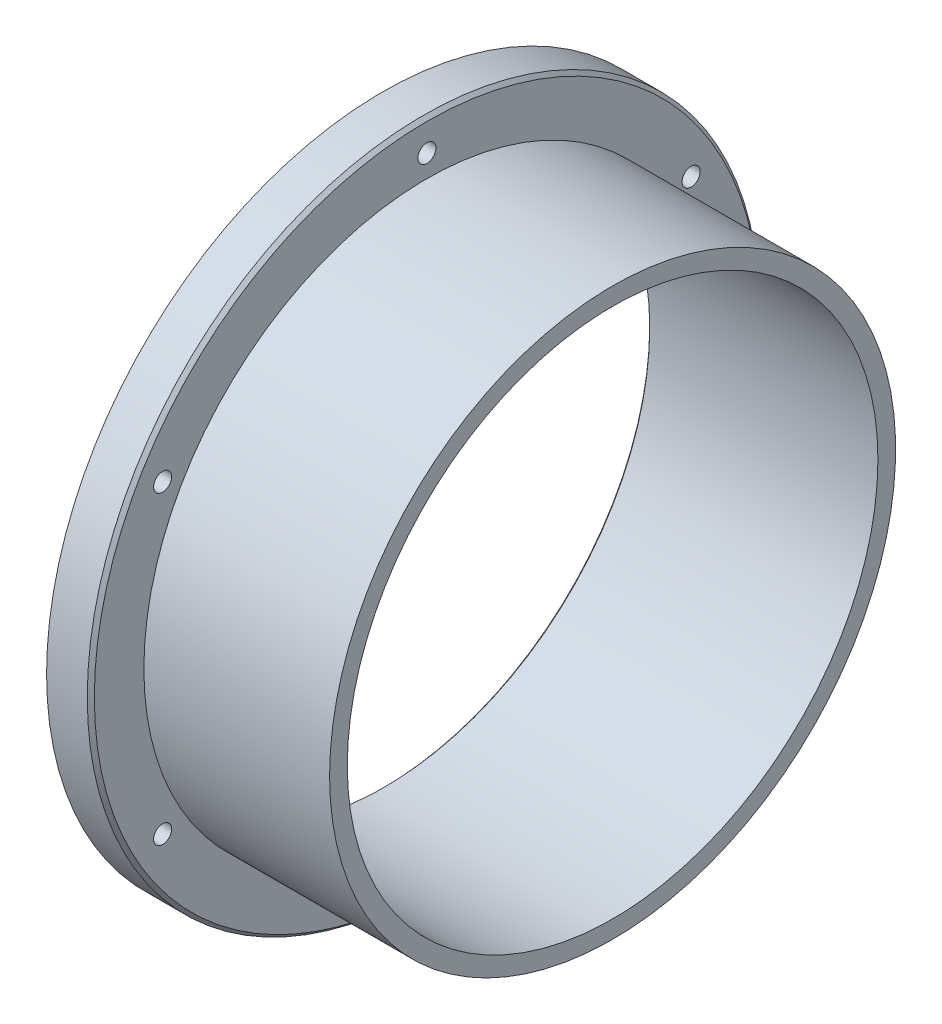
ISO-10303-21;
HEADER;
FILE_DESCRIPTION(('STEP AP214'),'2;1');
FILE_NAME('part.step','',(''),(''),'','','');
FILE_SCHEMA(('AUTOMOTIVE_DESIGN { 1 0 10303 214 1 1 1 1 }'));
ENDSEC;
DATA;
#1=APPLICATION_CONTEXT('core data for automotive mechanical design processes');
#2=APPLICATION_PROTOCOL_DEFINITION('international standard','automotive_design',2000,#1);
#3=PRODUCT_CONTEXT('',#1,'mechanical');
#4=PRODUCT('Part','Part','',(#3));
#5=PRODUCT_RELATED_PRODUCT_CATEGORY('part','',(#4));
#6=PRODUCT_DEFINITION_FORMATION('','',#4);
#7=PRODUCT_DEFINITION_CONTEXT('part definition',#1,'design');
#8=PRODUCT_DEFINITION('design','',#6,#7);
#9=PRODUCT_DEFINITION_SHAPE('','',#8);
#10=(LENGTH_UNIT() NAMED_UNIT(*) SI_UNIT(.MILLI.,.METRE.));
#11=(NAMED_UNIT(*) PLANE_ANGLE_UNIT() SI_UNIT($,.RADIAN.));
#12=(NAMED_UNIT(*) SI_UNIT($,.STERADIAN.) SOLID_ANGLE_UNIT());
#13=UNCERTAINTY_MEASURE_WITH_UNIT(LENGTH_MEASURE(1.E-05),#10,'distance_accuracy_value','');
#14=(GEOMETRIC_REPRESENTATION_CONTEXT(3) GLOBAL_UNCERTAINTY_ASSIGNED_CONTEXT((#13)) GLOBAL_UNIT_ASSIGNED_CONTEXT((#10,
#11,#12)) REPRESENTATION_CONTEXT('',''));
#15=CARTESIAN_POINT('',(0.,0.,0.));
#16=DIRECTION('',(0.,0.,1.));
#17=DIRECTION('',(1.,0.,0.));
#18=AXIS2_PLACEMENT_3D('',#15,#16,#17);
#19=CARTESIAN_POINT('',(-118.030303030303,190.,0.));
#20=DIRECTION('',(1.,0.,0.));
#21=DIRECTION('',(0.,0.,-1.));
#22=AXIS2_PLACEMENT_3D('',#19,#20,#21);
#23=PLANE('',#22);
#24=CARTESIAN_POINT('',(-118.030303030303,-86.2499999999986,149.389382152816));
#25=DIRECTION('',(-1.,0.,0.));
#26=DIRECTION('',(0.,0.,1.));
#27=AXIS2_PLACEMENT_3D('',#24,#25,#26);
#28=CIRCLE('',#27,5.09999999999999);
#29=CARTESIAN_POINT('',(-118.030303030303,-86.2499999999986,154.489382152816));
#30=VERTEX_POINT('',#29);
#31=EDGE_CURVE('E101',#30,#30,#28,.T.);
#32=ORIENTED_EDGE('',*,*,#31,.F.);
#33=EDGE_LOOP('',(#32));
#34=FACE_BOUND('',#33,.T.);
#35=CARTESIAN_POINT('',(-118.030303030303,-172.5,0.));
#36=DIRECTION('',(-1.,0.,0.));
#37=DIRECTION('',(0.,0.,1.));
#38=AXIS2_PLACEMENT_3D('',#35,#36,#37);
#39=CIRCLE('',#38,5.09999999999999);
#40=CARTESIAN_POINT('',(-118.030303030303,-172.5,5.09999999999999));
#41=VERTEX_POINT('',#40);
#42=EDGE_CURVE('E95',#41,#41,#39,.T.);
#43=ORIENTED_EDGE('',*,*,#42,.F.);
#44=EDGE_LOOP('',(#43));
#45=FACE_BOUND('',#44,.T.);
#46=CARTESIAN_POINT('',(-118.030303030303,-86.2500000000007,-149.389382152815));
#47=DIRECTION('',(-1.,0.,0.));
#48=DIRECTION('',(0.,0.,1.));
#49=AXIS2_PLACEMENT_3D('',#46,#47,#48);
#50=CIRCLE('',#49,5.10000000000001);
#51=CARTESIAN_POINT('',(-118.030303030303,-86.2500000000007,-144.289382152815));
#52=VERTEX_POINT('',#51);
#53=EDGE_CURVE('E89',#52,#52,#50,.T.);
#54=ORIENTED_EDGE('',*,*,#53,.F.);
#55=EDGE_LOOP('',(#54));
#56=FACE_BOUND('',#55,.T.);
#57=CARTESIAN_POINT('',(-118.030303030303,86.2499999999996,-149.389382152816));
#58=DIRECTION('',(-1.,0.,0.));
#59=DIRECTION('',(0.,0.,1.));
#60=AXIS2_PLACEMENT_3D('',#57,#58,#59);
#61=CIRCLE('',#60,5.10000000000001);
#62=CARTESIAN_POINT('',(-118.030303030303,86.2499999999996,-144.289382152816));
#63=VERTEX_POINT('',#62);
#64=EDGE_CURVE('E83',#63,#63,#61,.T.);
#65=ORIENTED_EDGE('',*,*,#64,.F.);
#66=EDGE_LOOP('',(#65));
#67=FACE_BOUND('',#66,.T.);
#68=CARTESIAN_POINT('',(-118.030303030303,172.5,0.));
#69=DIRECTION('',(-1.,0.,0.));
#70=DIRECTION('',(0.,0.,1.));
#71=AXIS2_PLACEMENT_3D('',#68,#69,#70);
#72=CIRCLE('',#71,5.09999999999999);
#73=CARTESIAN_POINT('',(-118.030303030303,172.5,5.09999999999999));
#74=VERTEX_POINT('',#73);
#75=EDGE_CURVE('E77',#74,#74,#72,.T.);
#76=ORIENTED_EDGE('',*,*,#75,.F.);
#77=EDGE_LOOP('',(#76));
#78=FACE_BOUND('',#77,.T.);
#79=CARTESIAN_POINT('',(-118.030303030303,0.,0.));
#80=DIRECTION('',(1.,0.,0.));
#81=DIRECTION('',(0.,0.,-1.));
#82=AXIS2_PLACEMENT_3D('',#79,#80,#81);
#83=CIRCLE('',#82,151.);
#84=CARTESIAN_POINT('',(-118.030303030303,0.,-151.));
#85=VERTEX_POINT('',#84);
#86=EDGE_CURVE('E10',#85,#85,#83,.T.);
#87=ORIENTED_EDGE('',*,*,#86,.T.);
#88=EDGE_LOOP('',(#87));
#89=FACE_BOUND('',#88,.T.);
#90=CARTESIAN_POINT('',(-118.030303030303,0.,0.));
#91=DIRECTION('',(-1.,0.,0.));
#92=DIRECTION('',(0.,0.,1.));
#93=AXIS2_PLACEMENT_3D('',#90,#91,#92);
#94=CIRCLE('',#93,190.);
#95=CARTESIAN_POINT('',(-118.030303030303,0.,190.));
#96=VERTEX_POINT('',#95);
#97=EDGE_CURVE('E71',#96,#96,#94,.T.);
#98=ORIENTED_EDGE('',*,*,#97,.T.);
#99=EDGE_LOOP('',(#98));
#100=FACE_BOUND('',#99,.T.);
#101=CARTESIAN_POINT('',(-118.030303030303,86.2500000000017,149.389382152815));
#102=DIRECTION('',(-1.,0.,0.));
#103=DIRECTION('',(0.,0.,1.));
#104=AXIS2_PLACEMENT_3D('',#101,#102,#103);
#105=CIRCLE('',#104,5.09999999999999);
#106=CARTESIAN_POINT('',(-118.030303030303,86.2500000000017,154.489382152815));
#107=VERTEX_POINT('',#106);
#108=EDGE_CURVE('E104',#107,#107,#105,.T.);
#109=ORIENTED_EDGE('',*,*,#108,.F.);
#110=EDGE_LOOP('',(#109));
#111=FACE_BOUND('',#110,.T.);
#112=ADVANCED_FACE('F41',(#34,#45,#56,#67,#78,#89,#100,#111),#23,.F.);
#113=CARTESIAN_POINT('',(-311.484848484849,0.,0.));
#114=DIRECTION('',(-1.,0.,0.));
#115=DIRECTION('',(0.,0.,1.));
#116=AXIS2_PLACEMENT_3D('',#113,#114,#115);
#117=CYLINDRICAL_SURFACE('',#116,150.);
#118=CARTESIAN_POINT('',(-117.030303030303,0.,0.));
#119=DIRECTION('',(1.,0.,0.));
#120=DIRECTION('',(0.,0.,-1.));
#121=AXIS2_PLACEMENT_3D('',#118,#119,#120);
#122=CIRCLE('',#121,150.);
#123=CARTESIAN_POINT('',(-117.030303030303,0.,-150.));
#124=VERTEX_POINT('',#123);
#125=EDGE_CURVE('E50',#124,#124,#122,.F.);
#126=ORIENTED_EDGE('',*,*,#125,.T.);
#127=EDGE_LOOP('',(#126));
#128=FACE_BOUND('',#127,.T.);
#129=CARTESIAN_POINT('',(11.9696969696969,0.,0.));
#130=DIRECTION('',(-1.,0.,0.));
#131=DIRECTION('',(0.,0.,1.));
#132=AXIS2_PLACEMENT_3D('',#129,#130,#131);
#133=CIRCLE('',#132,150.);
#134=CARTESIAN_POINT('',(11.9696969696969,0.,150.));
#135=VERTEX_POINT('',#134);
#136=EDGE_CURVE('E62',#135,#135,#133,.T.);
#137=ORIENTED_EDGE('',*,*,#136,.F.);
#138=EDGE_LOOP('',(#137));
#139=FACE_BOUND('',#138,.T.);
#140=ADVANCED_FACE('F125',(#128,#139),#117,.F.);
#141=CARTESIAN_POINT('',(11.9696969696969,150.,0.));
#142=DIRECTION('',(-1.,0.,0.));
#143=DIRECTION('',(0.,0.,1.));
#144=AXIS2_PLACEMENT_3D('',#141,#142,#143);
#145=PLANE('',#144);
#146=CARTESIAN_POINT('',(11.9696969696969,0.,0.));
#147=DIRECTION('',(-1.,0.,0.));
#148=DIRECTION('',(0.,0.,1.));
#149=AXIS2_PLACEMENT_3D('',#146,#147,#148);
#150=CIRCLE('',#149,160.);
#151=CARTESIAN_POINT('',(11.9696969696969,0.,160.));
#152=VERTEX_POINT('',#151);
#153=EDGE_CURVE('E65',#152,#152,#150,.T.);
#154=ORIENTED_EDGE('',*,*,#153,.F.);
#155=EDGE_LOOP('',(#154));
#156=FACE_BOUND('',#155,.T.);
#157=ORIENTED_EDGE('',*,*,#136,.T.);
#158=EDGE_LOOP('',(#157));
#159=FACE_BOUND('',#158,.T.);
#160=ADVANCED_FACE('F131',(#156,#159),#145,.F.);
#161=CARTESIAN_POINT('',(-311.484848484849,0.,0.));
#162=DIRECTION('',(-1.,0.,0.));
#163=DIRECTION('',(0.,0.,1.));
#164=AXIS2_PLACEMENT_3D('',#161,#162,#163);
#165=CYLINDRICAL_SURFACE('',#164,160.);
#166=CARTESIAN_POINT('',(-93.0303030303031,0.,0.));
#167=DIRECTION('',(-1.,0.,0.));
#168=DIRECTION('',(0.,0.,1.));
#169=AXIS2_PLACEMENT_3D('',#166,#167,#168);
#170=CIRCLE('',#169,160.);
#171=CARTESIAN_POINT('',(-93.0303030303031,0.,160.));
#172=VERTEX_POINT('',#171);
#173=EDGE_CURVE('E68',#172,#172,#170,.T.);
#174=ORIENTED_EDGE('',*,*,#173,.F.);
#175=EDGE_LOOP('',(#174));
#176=FACE_BOUND('',#175,.T.);
#177=ORIENTED_EDGE('',*,*,#153,.T.);
#178=EDGE_LOOP('',(#177));
#179=FACE_BOUND('',#178,.T.);
#180=ADVANCED_FACE('F162',(#176,#179),#165,.T.);
#181=CARTESIAN_POINT('',(-93.0303030303031,160.,0.));
#182=DIRECTION('',(-1.,0.,0.));
#183=DIRECTION('',(0.,0.,1.));
#184=AXIS2_PLACEMENT_3D('',#181,#182,#183);
#185=PLANE('',#184);
#186=CARTESIAN_POINT('',(-93.0303030303031,86.2500000000017,149.389382152815));
#187=DIRECTION('',(-1.,0.,0.));
#188=DIRECTION('',(0.,0.,1.));
#189=AXIS2_PLACEMENT_3D('',#186,#187,#188);
#190=CIRCLE('',#189,5.09999999999999);
#191=CARTESIAN_POINT('',(-93.0303030303031,86.2500000000017,154.489382152815));
#192=VERTEX_POINT('',#191);
#193=EDGE_CURVE('E46',#192,#192,#190,.T.);
#194=ORIENTED_EDGE('',*,*,#193,.T.);
#195=EDGE_LOOP('',(#194));
#196=FACE_BOUND('',#195,.T.);
#197=CARTESIAN_POINT('',(-93.0303030303031,-86.2499999999986,149.389382152816));
#198=DIRECTION('',(-1.,0.,0.));
#199=DIRECTION('',(0.,0.,1.));
#200=AXIS2_PLACEMENT_3D('',#197,#198,#199);
#201=CIRCLE('',#200,5.09999999999999);
#202=CARTESIAN_POINT('',(-93.0303030303031,-86.2499999999986,154.489382152816));
#203=VERTEX_POINT('',#202);
#204=EDGE_CURVE('E98',#203,#203,#201,.T.);
#205=ORIENTED_EDGE('',*,*,#204,.T.);
#206=EDGE_LOOP('',(#205));
#207=FACE_BOUND('',#206,.T.);
#208=CARTESIAN_POINT('',(-93.0303030303031,-172.5,0.));
#209=DIRECTION('',(-1.,0.,0.));
#210=DIRECTION('',(0.,0.,1.));
#211=AXIS2_PLACEMENT_3D('',#208,#209,#210);
#212=CIRCLE('',#211,5.09999999999999);
#213=CARTESIAN_POINT('',(-93.0303030303031,-172.5,5.09999999999999));
#214=VERTEX_POINT('',#213);
#215=EDGE_CURVE('E92',#214,#214,#212,.T.);
#216=ORIENTED_EDGE('',*,*,#215,.T.);
#217=EDGE_LOOP('',(#216));
#218=FACE_BOUND('',#217,.T.);
#219=CARTESIAN_POINT('',(-93.0303030303031,-86.2500000000007,-149.389382152815));
#220=DIRECTION('',(-1.,0.,0.));
#221=DIRECTION('',(0.,0.,1.));
#222=AXIS2_PLACEMENT_3D('',#219,#220,#221);
#223=CIRCLE('',#222,5.1);
#224=CARTESIAN_POINT('',(-93.0303030303031,-86.2500000000007,-144.289382152815));
#225=VERTEX_POINT('',#224);
#226=EDGE_CURVE('E86',#225,#225,#223,.T.);
#227=ORIENTED_EDGE('',*,*,#226,.T.);
#228=EDGE_LOOP('',(#227));
#229=FACE_BOUND('',#228,.T.);
#230=CARTESIAN_POINT('',(-93.0303030303031,86.2499999999996,-149.389382152816));
#231=DIRECTION('',(-1.,0.,0.));
#232=DIRECTION('',(0.,0.,1.));
#233=AXIS2_PLACEMENT_3D('',#230,#231,#232);
#234=CIRCLE('',#233,5.1);
#235=CARTESIAN_POINT('',(-93.0303030303031,86.2499999999996,-144.289382152816));
#236=VERTEX_POINT('',#235);
#237=EDGE_CURVE('E80',#236,#236,#234,.T.);
#238=ORIENTED_EDGE('',*,*,#237,.T.);
#239=EDGE_LOOP('',(#238));
#240=FACE_BOUND('',#239,.T.);
#241=CARTESIAN_POINT('',(-93.0303030303031,172.5,0.));
#242=DIRECTION('',(-1.,0.,0.));
#243=DIRECTION('',(0.,0.,1.));
#244=AXIS2_PLACEMENT_3D('',#241,#242,#243);
#245=CIRCLE('',#244,5.09999999999999);
#246=CARTESIAN_POINT('',(-93.0303030303031,172.5,5.09999999999999));
#247=VERTEX_POINT('',#246);
#248=EDGE_CURVE('E74',#247,#247,#245,.T.);
#249=ORIENTED_EDGE('',*,*,#248,.T.);
#250=EDGE_LOOP('',(#249));
#251=FACE_BOUND('',#250,.T.);
#252=CARTESIAN_POINT('',(-93.0303030303031,0.,0.));
#253=DIRECTION('',(-1.,0.,0.));
#254=DIRECTION('',(0.,0.,1.));
#255=AXIS2_PLACEMENT_3D('',#252,#253,#254);
#256=CIRCLE('',#255,188.);
#257=CARTESIAN_POINT('',(-93.0303030303031,0.,188.));
#258=VERTEX_POINT('',#257);
#259=EDGE_CURVE('E54',#258,#258,#256,.F.);
#260=ORIENTED_EDGE('',*,*,#259,.T.);
#261=EDGE_LOOP('',(#260));
#262=FACE_BOUND('',#261,.T.);
#263=ORIENTED_EDGE('',*,*,#173,.T.);
#264=EDGE_LOOP('',(#263));
#265=FACE_BOUND('',#264,.T.);
#266=ADVANCED_FACE('F111',(#196,#207,#218,#229,#240,#251,#262,#265),#185,.F.);
#267=CARTESIAN_POINT('',(-311.484848484849,0.,0.));
#268=DIRECTION('',(-1.,0.,0.));
#269=DIRECTION('',(0.,0.,1.));
#270=AXIS2_PLACEMENT_3D('',#267,#268,#269);
#271=CYLINDRICAL_SURFACE('',#270,190.);
#272=CARTESIAN_POINT('',(-95.030303030303,0.,0.));
#273=DIRECTION('',(-1.,0.,0.));
#274=DIRECTION('',(0.,0.,1.));
#275=AXIS2_PLACEMENT_3D('',#272,#273,#274);
#276=CIRCLE('',#275,190.);
#277=CARTESIAN_POINT('',(-95.030303030303,0.,190.));
#278=VERTEX_POINT('',#277);
#279=EDGE_CURVE('E59',#278,#278,#276,.T.);
#280=ORIENTED_EDGE('',*,*,#279,.T.);
#281=EDGE_LOOP('',(#280));
#282=FACE_BOUND('',#281,.T.);
#283=ORIENTED_EDGE('',*,*,#97,.F.);
#284=EDGE_LOOP('',(#283));
#285=FACE_BOUND('',#284,.T.);
#286=ADVANCED_FACE('F142',(#282,#285),#271,.T.);
#287=CARTESIAN_POINT('',(-95.030303030303,0.,0.));
#288=DIRECTION('',(-1.,0.,0.));
#289=DIRECTION('',(0.,0.,1.));
#290=AXIS2_PLACEMENT_3D('',#287,#288,#289);
#291=CONICAL_SURFACE('',#290,190.,0.785398163397455);
#292=ORIENTED_EDGE('',*,*,#259,.F.);
#293=EDGE_LOOP('',(#292));
#294=FACE_BOUND('',#293,.T.);
#295=ORIENTED_EDGE('',*,*,#279,.F.);
#296=EDGE_LOOP('',(#295));
#297=FACE_BOUND('',#296,.T.);
#298=ADVANCED_FACE('F138',(#294,#297),#291,.T.);
#299=CARTESIAN_POINT('',(-117.030303030303,0.,0.));
#300=DIRECTION('',(-1.,0.,0.));
#301=DIRECTION('',(0.,0.,1.));
#302=AXIS2_PLACEMENT_3D('',#299,#300,#301);
#303=CONICAL_SURFACE('',#302,150.,0.785398163397421);
#304=ORIENTED_EDGE('',*,*,#86,.F.);
#305=EDGE_LOOP('',(#304));
#306=FACE_BOUND('',#305,.T.);
#307=ORIENTED_EDGE('',*,*,#125,.F.);
#308=EDGE_LOOP('',(#307));
#309=FACE_BOUND('',#308,.T.);
#310=ADVANCED_FACE('F44',(#306,#309),#303,.F.);
#311=CARTESIAN_POINT('',(-118.030303030303,172.5,0.));
#312=DIRECTION('',(-1.,0.,0.));
#313=DIRECTION('',(0.,0.,1.));
#314=AXIS2_PLACEMENT_3D('',#311,#312,#313);
#315=CYLINDRICAL_SURFACE('',#314,5.09999999999999);
#316=ORIENTED_EDGE('',*,*,#75,.T.);
#317=EDGE_LOOP('',(#316));
#318=FACE_BOUND('',#317,.T.);
#319=ORIENTED_EDGE('',*,*,#248,.F.);
#320=EDGE_LOOP('',(#319));
#321=FACE_BOUND('',#320,.T.);
#322=ADVANCED_FACE('F148',(#318,#321),#315,.F.);
#323=CARTESIAN_POINT('',(-118.030303030303,86.2499999999996,-149.389382152816));
#324=DIRECTION('',(-1.,0.,0.));
#325=DIRECTION('',(0.,0.,1.));
#326=AXIS2_PLACEMENT_3D('',#323,#324,#325);
#327=CYLINDRICAL_SURFACE('',#326,5.1);
#328=ORIENTED_EDGE('',*,*,#64,.T.);
#329=EDGE_LOOP('',(#328));
#330=FACE_BOUND('',#329,.T.);
#331=ORIENTED_EDGE('',*,*,#237,.F.);
#332=EDGE_LOOP('',(#331));
#333=FACE_BOUND('',#332,.T.);
#334=ADVANCED_FACE('F180',(#330,#333),#327,.F.);
#335=CARTESIAN_POINT('',(-118.030303030303,-86.2500000000007,-149.389382152815));
#336=DIRECTION('',(-1.,0.,0.));
#337=DIRECTION('',(0.,0.,1.));
#338=AXIS2_PLACEMENT_3D('',#335,#336,#337);
#339=CYLINDRICAL_SURFACE('',#338,5.1);
#340=ORIENTED_EDGE('',*,*,#53,.T.);
#341=EDGE_LOOP('',(#340));
#342=FACE_BOUND('',#341,.T.);
#343=ORIENTED_EDGE('',*,*,#226,.F.);
#344=EDGE_LOOP('',(#343));
#345=FACE_BOUND('',#344,.T.);
#346=ADVANCED_FACE('F184',(#342,#345),#339,.F.);
#347=CARTESIAN_POINT('',(-118.030303030303,-172.5,0.));
#348=DIRECTION('',(-1.,0.,0.));
#349=DIRECTION('',(0.,0.,1.));
#350=AXIS2_PLACEMENT_3D('',#347,#348,#349);
#351=CYLINDRICAL_SURFACE('',#350,5.09999999999999);
#352=ORIENTED_EDGE('',*,*,#42,.T.);
#353=EDGE_LOOP('',(#352));
#354=FACE_BOUND('',#353,.T.);
#355=ORIENTED_EDGE('',*,*,#215,.F.);
#356=EDGE_LOOP('',(#355));
#357=FACE_BOUND('',#356,.T.);
#358=ADVANCED_FACE('F121',(#354,#357),#351,.F.);
#359=CARTESIAN_POINT('',(-118.030303030303,-86.2499999999986,149.389382152816));
#360=DIRECTION('',(-1.,0.,0.));
#361=DIRECTION('',(0.,0.,1.));
#362=AXIS2_PLACEMENT_3D('',#359,#360,#361);
#363=CYLINDRICAL_SURFACE('',#362,5.09999999999999);
#364=ORIENTED_EDGE('',*,*,#31,.T.);
#365=EDGE_LOOP('',(#364));
#366=FACE_BOUND('',#365,.T.);
#367=ORIENTED_EDGE('',*,*,#204,.F.);
#368=EDGE_LOOP('',(#367));
#369=FACE_BOUND('',#368,.T.);
#370=ADVANCED_FACE('F116',(#366,#369),#363,.F.);
#371=CARTESIAN_POINT('',(-118.030303030303,86.2500000000017,149.389382152815));
#372=DIRECTION('',(-1.,0.,0.));
#373=DIRECTION('',(0.,0.,1.));
#374=AXIS2_PLACEMENT_3D('',#371,#372,#373);
#375=CYLINDRICAL_SURFACE('',#374,5.09999999999999);
#376=ORIENTED_EDGE('',*,*,#108,.T.);
#377=EDGE_LOOP('',(#376));
#378=FACE_BOUND('',#377,.T.);
#379=ORIENTED_EDGE('',*,*,#193,.F.);
#380=EDGE_LOOP('',(#379));
#381=FACE_BOUND('',#380,.T.);
#382=ADVANCED_FACE('F114',(#378,#381),#375,.F.);
#383=CLOSED_SHELL('',(#112,#140,#160,#180,#266,#286,#298,#310,#322,#334,#346,#358,#370,#382));
#384=MANIFOLD_SOLID_BREP('B2',#383);
#385=ADVANCED_BREP_SHAPE_REPRESENTATION('',(#18,#384),#14);
#386=SHAPE_DEFINITION_REPRESENTATION(#9,#385);
ENDSEC;
END-ISO-10303-21;
